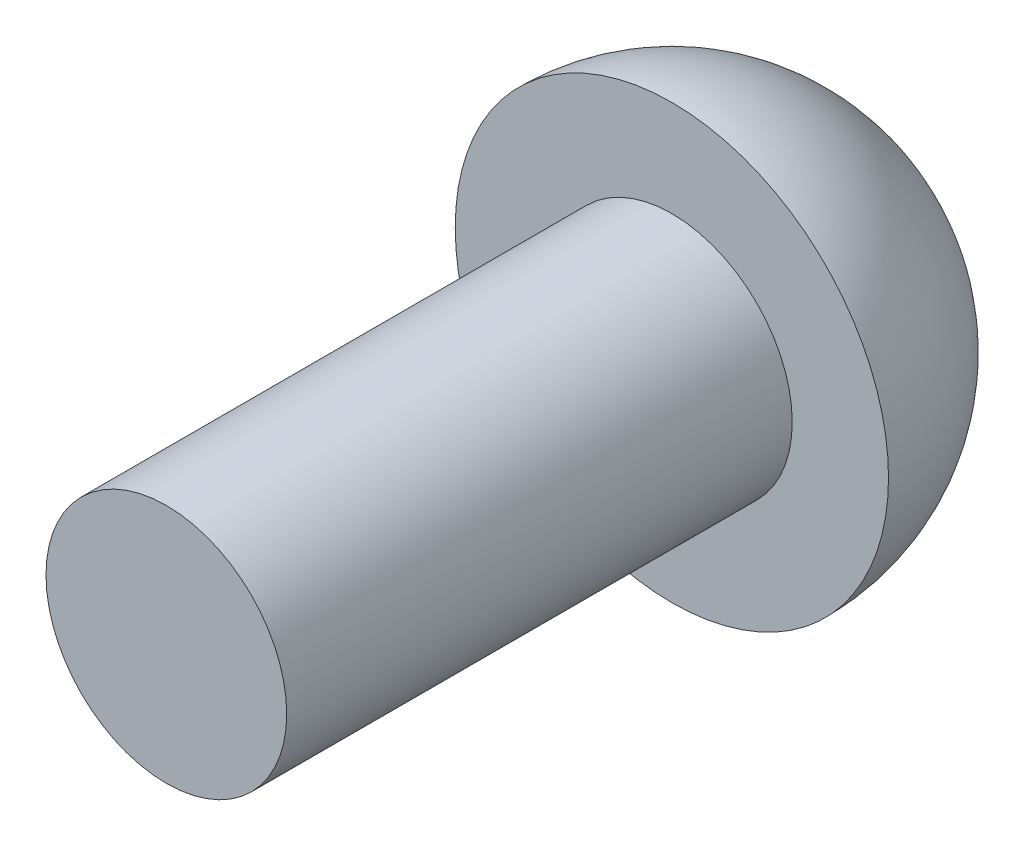
ISO-10303-21;
HEADER;
FILE_DESCRIPTION(('STEP AP214'),'2;1');
FILE_NAME('part.step','',(''),(''),'','','');
FILE_SCHEMA(('AUTOMOTIVE_DESIGN { 1 0 10303 214 1 1 1 1 }'));
ENDSEC;
DATA;
#1=APPLICATION_CONTEXT('core data for automotive mechanical design processes');
#2=APPLICATION_PROTOCOL_DEFINITION('international standard','automotive_design',2000,#1);
#3=PRODUCT_CONTEXT('',#1,'mechanical');
#4=PRODUCT('Part','Part','',(#3));
#5=PRODUCT_RELATED_PRODUCT_CATEGORY('part','',(#4));
#6=PRODUCT_DEFINITION_FORMATION('','',#4);
#7=PRODUCT_DEFINITION_CONTEXT('part definition',#1,'design');
#8=PRODUCT_DEFINITION('design','',#6,#7);
#9=PRODUCT_DEFINITION_SHAPE('','',#8);
#10=(LENGTH_UNIT() NAMED_UNIT(*) SI_UNIT(.MILLI.,.METRE.));
#11=(NAMED_UNIT(*) PLANE_ANGLE_UNIT() SI_UNIT($,.RADIAN.));
#12=(NAMED_UNIT(*) SI_UNIT($,.STERADIAN.) SOLID_ANGLE_UNIT());
#13=UNCERTAINTY_MEASURE_WITH_UNIT(LENGTH_MEASURE(1.E-05),#10,'distance_accuracy_value','');
#14=(GEOMETRIC_REPRESENTATION_CONTEXT(3) GLOBAL_UNCERTAINTY_ASSIGNED_CONTEXT((#13)) GLOBAL_UNIT_ASSIGNED_CONTEXT((#10,
#11,#12)) REPRESENTATION_CONTEXT('',''));
#15=CARTESIAN_POINT('',(0.,0.,0.));
#16=DIRECTION('',(0.,0.,1.));
#17=DIRECTION('',(1.,0.,0.));
#18=AXIS2_PLACEMENT_3D('',#15,#16,#17);
#19=CARTESIAN_POINT('',(0.,0.,0.));
#20=DIRECTION('',(0.,1.,0.));
#21=DIRECTION('',(-1.,0.,0.));
#22=AXIS2_PLACEMENT_3D('',#19,#20,#21);
#23=SPHERICAL_SURFACE('',#22,9.);
#24=CARTESIAN_POINT('',(0.,0.,0.));
#25=DIRECTION('',(0.,0.,-1.));
#26=DIRECTION('',(-1.,0.,0.));
#27=AXIS2_PLACEMENT_3D('',#24,#25,#26);
#28=SPHERICAL_SURFACE('',#27,9.);
#29=CARTESIAN_POINT('',(0.,0.,0.));
#30=DIRECTION('',(0.,0.,-1.));
#31=DIRECTION('',(-1.,0.,0.));
#32=AXIS2_PLACEMENT_3D('',#29,#30,#31);
#33=CIRCLE('',#32,9.);
#34=CARTESIAN_POINT('',(-9.,0.,0.));
#35=VERTEX_POINT('',#34);
#36=EDGE_CURVE('E37',#35,#35,#33,.T.);
#37=ORIENTED_EDGE('',*,*,#36,.T.);
#38=EDGE_LOOP('',(#37));
#39=FACE_BOUND('',#38,.T.);
#40=ADVANCED_FACE('F31',(#39),#28,.T.);
#41=CARTESIAN_POINT('',(0.,0.,0.));
#42=DIRECTION('',(0.,0.,-1.));
#43=DIRECTION('',(-1.,0.,0.));
#44=AXIS2_PLACEMENT_3D('',#41,#42,#43);
#45=PLANE('',#44);
#46=CARTESIAN_POINT('',(0.,0.,0.));
#47=DIRECTION('',(0.,0.,-1.));
#48=DIRECTION('',(-1.,0.,0.));
#49=AXIS2_PLACEMENT_3D('',#46,#47,#48);
#50=CIRCLE('',#49,5.);
#51=CARTESIAN_POINT('',(-5.,0.,0.));
#52=VERTEX_POINT('',#51);
#53=EDGE_CURVE('E10',#52,#52,#50,.F.);
#54=ORIENTED_EDGE('',*,*,#53,.F.);
#55=EDGE_LOOP('',(#54));
#56=FACE_BOUND('',#55,.T.);
#57=ORIENTED_EDGE('',*,*,#36,.F.);
#58=EDGE_LOOP('',(#57));
#59=FACE_BOUND('',#58,.T.);
#60=ADVANCED_FACE('F52',(#56,#59),#45,.F.);
#61=CARTESIAN_POINT('',(0.,0.,21.));
#62=DIRECTION('',(0.,0.,-1.));
#63=DIRECTION('',(-1.,0.,0.));
#64=AXIS2_PLACEMENT_3D('',#61,#62,#63);
#65=CYLINDRICAL_SURFACE('',#64,5.);
#66=CARTESIAN_POINT('',(0.,0.,21.));
#67=DIRECTION('',(0.,0.,1.));
#68=DIRECTION('',(1.,0.,0.));
#69=AXIS2_PLACEMENT_3D('',#66,#67,#68);
#70=CIRCLE('',#69,5.);
#71=CARTESIAN_POINT('',(-5.,0.,21.));
#72=VERTEX_POINT('',#71);
#73=EDGE_CURVE('E41',#72,#72,#70,.T.);
#74=CARTESIAN_POINT('',(-5.,0.,21.));
#75=CARTESIAN_POINT('',(-5.,0.,20.78125));
#76=CARTESIAN_POINT('',(-5.,0.,20.5625));
#77=CARTESIAN_POINT('',(-5.,0.,20.125));
#78=CARTESIAN_POINT('',(-5.,0.,19.90625));
#79=CARTESIAN_POINT('',(-5.,0.,19.46875));
#80=CARTESIAN_POINT('',(-5.,0.,19.25));
#81=CARTESIAN_POINT('',(-5.,0.,18.8125));
#82=CARTESIAN_POINT('',(-5.,0.,18.59375));
#83=CARTESIAN_POINT('',(-5.,0.,18.15625));
#84=CARTESIAN_POINT('',(-5.,0.,17.9375));
#85=CARTESIAN_POINT('',(-5.,0.,17.5));
#86=CARTESIAN_POINT('',(-5.,0.,17.28125));
#87=CARTESIAN_POINT('',(-5.,0.,16.84375));
#88=CARTESIAN_POINT('',(-5.,0.,16.625));
#89=CARTESIAN_POINT('',(-5.,0.,16.1875));
#90=CARTESIAN_POINT('',(-5.,0.,15.96875));
#91=CARTESIAN_POINT('',(-5.,0.,15.53125));
#92=CARTESIAN_POINT('',(-5.,0.,15.3125));
#93=CARTESIAN_POINT('',(-5.,0.,14.875));
#94=CARTESIAN_POINT('',(-5.,0.,14.65625));
#95=CARTESIAN_POINT('',(-5.,0.,14.21875));
#96=CARTESIAN_POINT('',(-5.,0.,14.));
#97=CARTESIAN_POINT('',(-5.,0.,13.5625));
#98=CARTESIAN_POINT('',(-5.,0.,13.34375));
#99=CARTESIAN_POINT('',(-5.,0.,12.90625));
#100=CARTESIAN_POINT('',(-5.,0.,12.6875));
#101=CARTESIAN_POINT('',(-5.,0.,12.25));
#102=CARTESIAN_POINT('',(-5.,0.,12.03125));
#103=CARTESIAN_POINT('',(-5.,0.,11.59375));
#104=CARTESIAN_POINT('',(-5.,0.,11.375));
#105=CARTESIAN_POINT('',(-5.,0.,10.9375));
#106=CARTESIAN_POINT('',(-5.,0.,10.71875));
#107=CARTESIAN_POINT('',(-5.,0.,10.28125));
#108=CARTESIAN_POINT('',(-5.,0.,10.0625));
#109=CARTESIAN_POINT('',(-5.,0.,9.62499999999998));
#110=CARTESIAN_POINT('',(-5.,0.,9.40624999999998));
#111=CARTESIAN_POINT('',(-5.,0.,8.96874999999998));
#112=CARTESIAN_POINT('',(-5.,0.,8.74999999999998));
#113=CARTESIAN_POINT('',(-5.,0.,8.31249999999998));
#114=CARTESIAN_POINT('',(-5.,0.,8.09374999999998));
#115=CARTESIAN_POINT('',(-5.,0.,7.65624999999998));
#116=CARTESIAN_POINT('',(-5.,0.,7.43749999999998));
#117=CARTESIAN_POINT('',(-5.,0.,6.99999999999998));
#118=CARTESIAN_POINT('',(-5.,0.,6.78124999999998));
#119=CARTESIAN_POINT('',(-5.,0.,6.34374999999997));
#120=CARTESIAN_POINT('',(-5.,0.,6.12499999999997));
#121=CARTESIAN_POINT('',(-5.,0.,5.68749999999997));
#122=CARTESIAN_POINT('',(-5.,0.,5.46874999999998));
#123=CARTESIAN_POINT('',(-5.,0.,5.03124999999998));
#124=CARTESIAN_POINT('',(-5.,0.,4.81249999999997));
#125=CARTESIAN_POINT('',(-5.,0.,4.37499999999997));
#126=CARTESIAN_POINT('',(-5.,0.,4.15624999999997));
#127=CARTESIAN_POINT('',(-5.,0.,3.71874999999997));
#128=CARTESIAN_POINT('',(-5.,0.,3.49999999999997));
#129=CARTESIAN_POINT('',(-5.,0.,3.06249999999997));
#130=CARTESIAN_POINT('',(-5.,0.,2.84374999999997));
#131=CARTESIAN_POINT('',(-5.,0.,2.40624999999997));
#132=CARTESIAN_POINT('',(-5.,0.,2.18749999999997));
#133=CARTESIAN_POINT('',(-5.,0.,1.74999999999997));
#134=CARTESIAN_POINT('',(-5.,0.,1.53124999999997));
#135=CARTESIAN_POINT('',(-5.,0.,1.09374999999997));
#136=CARTESIAN_POINT('',(-5.,0.,0.874999999999966));
#137=CARTESIAN_POINT('',(-5.,0.,0.437499999999966));
#138=CARTESIAN_POINT('',(-5.,0.,0.218749999999965));
#139=CARTESIAN_POINT('',(-5.,0.,0.));
#140=B_SPLINE_CURVE_WITH_KNOTS('',3,(#74,#75,#76,#77,#78,#79,#80,#81,#82,#83,#84,#85,#86,#87,
#88,#89,#90,#91,#92,#93,#94,#95,#96,#97,#98,#99,#100,#101,#102,#103,#104,#105,#106,#107,#108,
#109,#110,#111,#112,#113,#114,#115,#116,#117,#118,#119,#120,#121,#122,#123,#124,#125,#126,#127,
#128,#129,#130,#131,#132,#133,#134,#135,#136,#137,#138,#139),.UNSPECIFIED.,.F.,.F.,(4,2,2,2,2,2,
2,2,2,2,2,2,2,2,2,2,2,2,2,2,2,2,2,2,2,2,2,2,2,2,2,2,4),(0.,0.656250000000004,1.3125,
1.96875000000001,2.62500000000001,3.28125000000001,3.93750000000001,4.59375000000001,
5.25000000000001,5.90625000000001,6.56250000000001,7.21875000000001,7.87500000000001,
8.53125000000002,9.18750000000002,9.84375000000002,10.5,11.15625,11.8125,12.46875,13.125,
13.78125,14.4375,15.09375,15.75,16.40625,17.0625,17.71875,18.375,19.03125,19.6875,20.34375,21.),.UNSPECIFIED.);
#141=EDGE_CURVE('BSEAM50',#72,#52,#140,.T.);
#142=ORIENTED_EDGE('',*,*,#73,.F.);
#143=ORIENTED_EDGE('',*,*,#53,.T.);
#144=ORIENTED_EDGE('',*,*,#141,.T.);
#145=ORIENTED_EDGE('',*,*,#141,.F.);
#146=EDGE_LOOP('',(#142,#144,#143,#145));
#147=FACE_BOUND('',#146,.T.);
#148=ADVANCED_FACE('F50',(#147),#65,.T.);
#149=CARTESIAN_POINT('',(0.,0.,21.));
#150=DIRECTION('',(0.,0.,1.));
#151=DIRECTION('',(1.,0.,0.));
#152=AXIS2_PLACEMENT_3D('',#149,#150,#151);
#153=PLANE('',#152);
#154=ORIENTED_EDGE('',*,*,#73,.T.);
#155=EDGE_LOOP('',(#154));
#156=FACE_BOUND('',#155,.T.);
#157=ADVANCED_FACE('F48',(#156),#153,.T.);
#158=CLOSED_SHELL('',(#40,#60,#148,#157));
#159=MANIFOLD_SOLID_BREP('B2',#158);
#160=ADVANCED_BREP_SHAPE_REPRESENTATION('',(#18,#159),#14);
#161=SHAPE_DEFINITION_REPRESENTATION(#9,#160);
ENDSEC;
END-ISO-10303-21;
